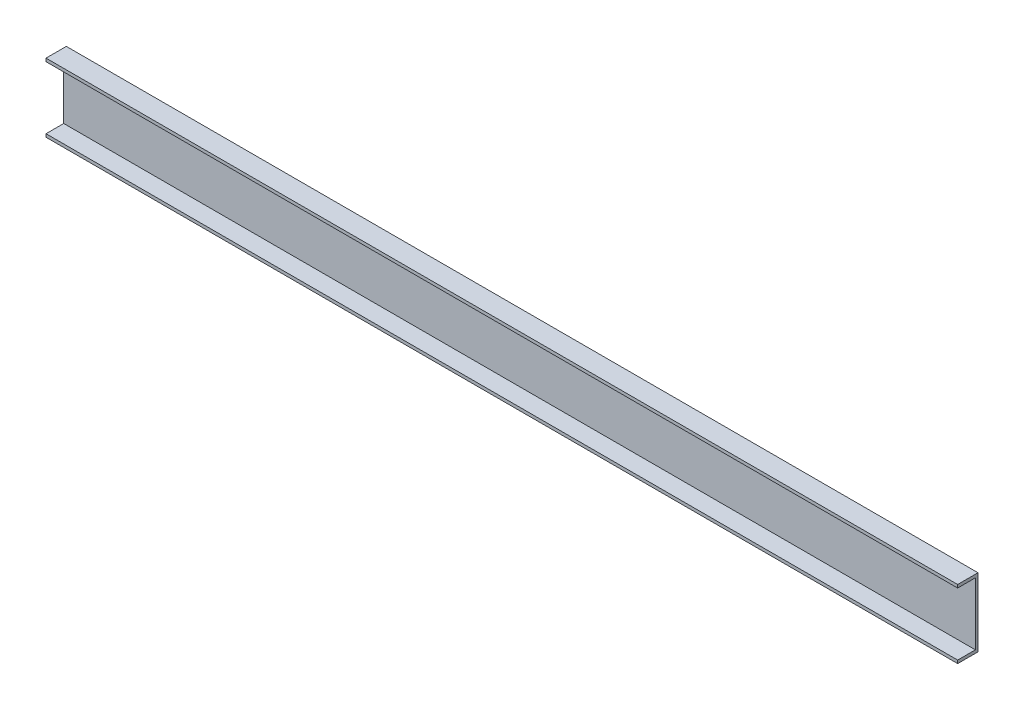
ISO-10303-21;
HEADER;
FILE_DESCRIPTION(('STEP AP214'),'2;1');
FILE_NAME('part.step','',(''),(''),'','','');
FILE_SCHEMA(('AUTOMOTIVE_DESIGN { 1 0 10303 214 1 1 1 1 }'));
ENDSEC;
DATA;
#1=APPLICATION_CONTEXT('core data for automotive mechanical design processes');
#2=APPLICATION_PROTOCOL_DEFINITION('international standard','automotive_design',2000,#1);
#3=PRODUCT_CONTEXT('',#1,'mechanical');
#4=PRODUCT('Part','Part','',(#3));
#5=PRODUCT_RELATED_PRODUCT_CATEGORY('part','',(#4));
#6=PRODUCT_DEFINITION_FORMATION('','',#4);
#7=PRODUCT_DEFINITION_CONTEXT('part definition',#1,'design');
#8=PRODUCT_DEFINITION('design','',#6,#7);
#9=PRODUCT_DEFINITION_SHAPE('','',#8);
#10=(LENGTH_UNIT() NAMED_UNIT(*) SI_UNIT(.MILLI.,.METRE.));
#11=(NAMED_UNIT(*) PLANE_ANGLE_UNIT() SI_UNIT($,.RADIAN.));
#12=(NAMED_UNIT(*) SI_UNIT($,.STERADIAN.) SOLID_ANGLE_UNIT());
#13=UNCERTAINTY_MEASURE_WITH_UNIT(LENGTH_MEASURE(1.E-05),#10,'distance_accuracy_value','');
#14=(GEOMETRIC_REPRESENTATION_CONTEXT(3) GLOBAL_UNCERTAINTY_ASSIGNED_CONTEXT((#13)) GLOBAL_UNIT_ASSIGNED_CONTEXT((#10,
#11,#12)) REPRESENTATION_CONTEXT('',''));
#15=CARTESIAN_POINT('',(0.,0.,0.));
#16=DIRECTION('',(0.,0.,1.));
#17=DIRECTION('',(1.,0.,0.));
#18=AXIS2_PLACEMENT_3D('',#15,#16,#17);
#19=CARTESIAN_POINT('',(-1995.,-150.,0.));
#20=DIRECTION('',(0.,0.,1.));
#21=DIRECTION('',(1.,0.,0.));
#22=AXIS2_PLACEMENT_3D('',#19,#20,#21);
#23=PLANE('',#22);
#24=DIRECTION('',(1.,0.,0.));
#25=VECTOR('',#24,1.);
#26=CARTESIAN_POINT('',(-935.,115.,0.));
#27=LINE('',#26,#25);
#28=CARTESIAN_POINT('',(-935.,115.,0.));
#29=VERTEX_POINT('',#28);
#30=CARTESIAN_POINT('',(-865.,115.,0.));
#31=VERTEX_POINT('',#30);
#32=EDGE_CURVE('E265',#29,#31,#27,.T.);
#33=ORIENTED_EDGE('',*,*,#32,.F.);
#34=DIRECTION('',(0.,1.,0.));
#35=VECTOR('',#34,1.);
#36=CARTESIAN_POINT('',(-935.,115.,0.));
#37=LINE('',#36,#35);
#38=CARTESIAN_POINT('',(-935.,-115.,0.));
#39=VERTEX_POINT('',#38);
#40=EDGE_CURVE('E278',#39,#29,#37,.T.);
#41=ORIENTED_EDGE('',*,*,#40,.F.);
#42=DIRECTION('',(-1.,0.,0.));
#43=VECTOR('',#42,1.);
#44=CARTESIAN_POINT('',(-935.,-115.,0.));
#45=LINE('',#44,#43);
#46=CARTESIAN_POINT('',(-865.,-115.,0.));
#47=VERTEX_POINT('',#46);
#48=EDGE_CURVE('E287',#47,#39,#45,.T.);
#49=ORIENTED_EDGE('',*,*,#48,.F.);
#50=DIRECTION('',(0.,-1.,0.));
#51=VECTOR('',#50,1.);
#52=CARTESIAN_POINT('',(-865.,115.,0.));
#53=LINE('',#52,#51);
#54=EDGE_CURVE('E268',#31,#47,#53,.T.);
#55=ORIENTED_EDGE('',*,*,#54,.F.);
#56=EDGE_LOOP('',(#33,#41,#49,#55));
#57=FACE_BOUND('',#56,.T.);
#58=DIRECTION('',(0.,-1.,0.));
#59=VECTOR('',#58,1.);
#60=CARTESIAN_POINT('',(535.,115.,0.));
#61=LINE('',#60,#59);
#62=CARTESIAN_POINT('',(535.,115.,0.));
#63=VERTEX_POINT('',#62);
#64=CARTESIAN_POINT('',(535.,-115.,0.));
#65=VERTEX_POINT('',#64);
#66=EDGE_CURVE('E336',#63,#65,#61,.T.);
#67=ORIENTED_EDGE('',*,*,#66,.F.);
#68=DIRECTION('',(1.,0.,0.));
#69=VECTOR('',#68,1.);
#70=CARTESIAN_POINT('',(535.,115.,0.));
#71=LINE('',#70,#69);
#72=CARTESIAN_POINT('',(465.,115.,0.));
#73=VERTEX_POINT('',#72);
#74=EDGE_CURVE('E341',#73,#63,#71,.T.);
#75=ORIENTED_EDGE('',*,*,#74,.F.);
#76=DIRECTION('',(0.,1.,0.));
#77=VECTOR('',#76,1.);
#78=CARTESIAN_POINT('',(465.,115.,0.));
#79=LINE('',#78,#77);
#80=CARTESIAN_POINT('',(465.,-115.,0.));
#81=VERTEX_POINT('',#80);
#82=EDGE_CURVE('E353',#81,#73,#79,.T.);
#83=ORIENTED_EDGE('',*,*,#82,.F.);
#84=DIRECTION('',(-1.,0.,0.));
#85=VECTOR('',#84,1.);
#86=CARTESIAN_POINT('',(535.,-115.,0.));
#87=LINE('',#86,#85);
#88=EDGE_CURVE('E350',#65,#81,#87,.T.);
#89=ORIENTED_EDGE('',*,*,#88,.F.);
#90=EDGE_LOOP('',(#67,#75,#83,#89));
#91=FACE_BOUND('',#90,.T.);
#92=DIRECTION('',(0.,-1.,0.));
#93=VECTOR('',#92,1.);
#94=CARTESIAN_POINT('',(1335.,115.,0.));
#95=LINE('',#94,#93);
#96=CARTESIAN_POINT('',(1335.,115.,0.));
#97=VERTEX_POINT('',#96);
#98=CARTESIAN_POINT('',(1335.,-115.,0.));
#99=VERTEX_POINT('',#98);
#100=EDGE_CURVE('E402',#97,#99,#95,.T.);
#101=ORIENTED_EDGE('',*,*,#100,.F.);
#102=DIRECTION('',(1.,0.,0.));
#103=VECTOR('',#102,1.);
#104=CARTESIAN_POINT('',(1335.,115.,0.));
#105=LINE('',#104,#103);
#106=CARTESIAN_POINT('',(1265.,115.,0.));
#107=VERTEX_POINT('',#106);
#108=EDGE_CURVE('E407',#107,#97,#105,.T.);
#109=ORIENTED_EDGE('',*,*,#108,.F.);
#110=DIRECTION('',(0.,1.,0.));
#111=VECTOR('',#110,1.);
#112=CARTESIAN_POINT('',(1265.,115.,0.));
#113=LINE('',#112,#111);
#114=CARTESIAN_POINT('',(1265.,-115.,0.));
#115=VERTEX_POINT('',#114);
#116=EDGE_CURVE('E419',#115,#107,#113,.T.);
#117=ORIENTED_EDGE('',*,*,#116,.F.);
#118=DIRECTION('',(-1.,0.,0.));
#119=VECTOR('',#118,1.);
#120=CARTESIAN_POINT('',(1335.,-115.,0.));
#121=LINE('',#120,#119);
#122=EDGE_CURVE('E416',#99,#115,#121,.T.);
#123=ORIENTED_EDGE('',*,*,#122,.F.);
#124=EDGE_LOOP('',(#101,#109,#117,#123));
#125=FACE_BOUND('',#124,.T.);
#126=DIRECTION('',(0.,-1.,0.));
#127=VECTOR('',#126,1.);
#128=CARTESIAN_POINT('',(-1995.,150.,0.));
#129=LINE('',#128,#127);
#130=CARTESIAN_POINT('',(-1995.,150.,0.));
#131=VERTEX_POINT('',#130);
#132=CARTESIAN_POINT('',(-1995.,-150.,0.));
#133=VERTEX_POINT('',#132);
#134=EDGE_CURVE('E481',#131,#133,#129,.T.);
#135=ORIENTED_EDGE('',*,*,#134,.F.);
#136=DIRECTION('',(-1.,0.,0.));
#137=VECTOR('',#136,1.);
#138=CARTESIAN_POINT('',(-1995.,150.,0.));
#139=LINE('',#138,#137);
#140=CARTESIAN_POINT('',(1995.,150.,0.));
#141=VERTEX_POINT('',#140);
#142=EDGE_CURVE('E496',#141,#131,#139,.T.);
#143=ORIENTED_EDGE('',*,*,#142,.F.);
#144=DIRECTION('',(0.,1.,0.));
#145=VECTOR('',#144,1.);
#146=CARTESIAN_POINT('',(1995.,150.,0.));
#147=LINE('',#146,#145);
#148=CARTESIAN_POINT('',(1995.,-150.,0.));
#149=VERTEX_POINT('',#148);
#150=EDGE_CURVE('E491',#149,#141,#147,.T.);
#151=ORIENTED_EDGE('',*,*,#150,.F.);
#152=DIRECTION('',(1.,0.,0.));
#153=VECTOR('',#152,1.);
#154=CARTESIAN_POINT('',(-1995.,-150.,0.));
#155=LINE('',#154,#153);
#156=EDGE_CURVE('E486',#133,#149,#155,.T.);
#157=ORIENTED_EDGE('',*,*,#156,.F.);
#158=EDGE_LOOP('',(#135,#143,#151,#157));
#159=FACE_BOUND('',#158,.T.);
#160=DIRECTION('',(0.,-1.,0.));
#161=VECTOR('',#160,1.);
#162=CARTESIAN_POINT('',(935.,115.,0.));
#163=LINE('',#162,#161);
#164=CARTESIAN_POINT('',(935.,115.,0.));
#165=VERTEX_POINT('',#164);
#166=CARTESIAN_POINT('',(935.,-115.,0.));
#167=VERTEX_POINT('',#166);
#168=EDGE_CURVE('E369',#165,#167,#163,.T.);
#169=ORIENTED_EDGE('',*,*,#168,.F.);
#170=DIRECTION('',(1.,0.,0.));
#171=VECTOR('',#170,1.);
#172=CARTESIAN_POINT('',(935.,115.,0.));
#173=LINE('',#172,#171);
#174=CARTESIAN_POINT('',(865.,115.,0.));
#175=VERTEX_POINT('',#174);
#176=EDGE_CURVE('E374',#175,#165,#173,.T.);
#177=ORIENTED_EDGE('',*,*,#176,.F.);
#178=DIRECTION('',(0.,1.,0.));
#179=VECTOR('',#178,1.);
#180=CARTESIAN_POINT('',(865.,115.,0.));
#181=LINE('',#180,#179);
#182=CARTESIAN_POINT('',(865.,-115.,0.));
#183=VERTEX_POINT('',#182);
#184=EDGE_CURVE('E386',#183,#175,#181,.T.);
#185=ORIENTED_EDGE('',*,*,#184,.F.);
#186=DIRECTION('',(-1.,0.,0.));
#187=VECTOR('',#186,1.);
#188=CARTESIAN_POINT('',(935.,-115.,0.));
#189=LINE('',#188,#187);
#190=EDGE_CURVE('E383',#167,#183,#189,.T.);
#191=ORIENTED_EDGE('',*,*,#190,.F.);
#192=EDGE_LOOP('',(#169,#177,#185,#191));
#193=FACE_BOUND('',#192,.T.);
#194=DIRECTION('',(1.,0.,0.));
#195=VECTOR('',#194,1.);
#196=CARTESIAN_POINT('',(-535.,115.,0.));
#197=LINE('',#196,#195);
#198=CARTESIAN_POINT('',(-535.,115.,0.));
#199=VERTEX_POINT('',#198);
#200=CARTESIAN_POINT('',(-465.,115.,0.));
#201=VERTEX_POINT('',#200);
#202=EDGE_CURVE('E303',#199,#201,#197,.T.);
#203=ORIENTED_EDGE('',*,*,#202,.F.);
#204=DIRECTION('',(0.,1.,0.));
#205=VECTOR('',#204,1.);
#206=CARTESIAN_POINT('',(-535.,115.,0.));
#207=LINE('',#206,#205);
#208=CARTESIAN_POINT('',(-535.,-115.,0.));
#209=VERTEX_POINT('',#208);
#210=EDGE_CURVE('E308',#209,#199,#207,.T.);
#211=ORIENTED_EDGE('',*,*,#210,.F.);
#212=DIRECTION('',(-1.,0.,0.));
#213=VECTOR('',#212,1.);
#214=CARTESIAN_POINT('',(-535.,-115.,0.));
#215=LINE('',#214,#213);
#216=CARTESIAN_POINT('',(-465.,-115.,0.));
#217=VERTEX_POINT('',#216);
#218=EDGE_CURVE('E320',#217,#209,#215,.T.);
#219=ORIENTED_EDGE('',*,*,#218,.F.);
#220=DIRECTION('',(0.,-1.,0.));
#221=VECTOR('',#220,1.);
#222=CARTESIAN_POINT('',(-465.,115.,0.));
#223=LINE('',#222,#221);
#224=EDGE_CURVE('E317',#201,#217,#223,.T.);
#225=ORIENTED_EDGE('',*,*,#224,.F.);
#226=EDGE_LOOP('',(#203,#211,#219,#225));
#227=FACE_BOUND('',#226,.T.);
#228=DIRECTION('',(1.,0.,0.));
#229=VECTOR('',#228,1.);
#230=CARTESIAN_POINT('',(-1335.,115.,0.));
#231=LINE('',#230,#229);
#232=CARTESIAN_POINT('',(-1335.,115.,0.));
#233=VERTEX_POINT('',#232);
#234=CARTESIAN_POINT('',(-1265.,115.,0.));
#235=VERTEX_POINT('',#234);
#236=EDGE_CURVE('E264',#233,#235,#231,.T.);
#237=ORIENTED_EDGE('',*,*,#236,.F.);
#238=DIRECTION('',(0.,1.,0.));
#239=VECTOR('',#238,1.);
#240=CARTESIAN_POINT('',(-1335.,115.,0.));
#241=LINE('',#240,#239);
#242=CARTESIAN_POINT('',(-1335.,-115.,0.));
#243=VERTEX_POINT('',#242);
#244=EDGE_CURVE('E261',#243,#233,#241,.T.);
#245=ORIENTED_EDGE('',*,*,#244,.F.);
#246=DIRECTION('',(-1.,0.,0.));
#247=VECTOR('',#246,1.);
#248=CARTESIAN_POINT('',(-1335.,-115.,0.));
#249=LINE('',#248,#247);
#250=CARTESIAN_POINT('',(-1265.,-115.,0.));
#251=VERTEX_POINT('',#250);
#252=EDGE_CURVE('E55',#251,#243,#249,.T.);
#253=ORIENTED_EDGE('',*,*,#252,.F.);
#254=DIRECTION('',(0.,-1.,0.));
#255=VECTOR('',#254,1.);
#256=CARTESIAN_POINT('',(-1265.,115.,0.));
#257=LINE('',#256,#255);
#258=EDGE_CURVE('E50',#235,#251,#257,.T.);
#259=ORIENTED_EDGE('',*,*,#258,.F.);
#260=EDGE_LOOP('',(#237,#245,#253,#259));
#261=FACE_BOUND('',#260,.T.);
#262=ADVANCED_FACE('F32',(#57,#91,#125,#159,#193,#227,#261),#23,.F.);
#263=CARTESIAN_POINT('',(-1995.,-150.,11.5));
#264=DIRECTION('',(0.,0.,1.));
#265=DIRECTION('',(1.,0.,0.));
#266=AXIS2_PLACEMENT_3D('',#263,#264,#265);
#267=PLANE('',#266);
#268=DIRECTION('',(0.,-1.,0.));
#269=VECTOR('',#268,1.);
#270=CARTESIAN_POINT('',(-1995.,150.,11.5));
#271=LINE('',#270,#269);
#272=CARTESIAN_POINT('',(-1995.,136.5,11.5));
#273=VERTEX_POINT('',#272);
#274=CARTESIAN_POINT('',(-1995.,-136.5,11.5));
#275=VERTEX_POINT('',#274);
#276=EDGE_CURVE('E474',#273,#275,#271,.T.);
#277=ORIENTED_EDGE('',*,*,#276,.T.);
#278=DIRECTION('',(-1.,0.,0.));
#279=VECTOR('',#278,1.);
#280=CARTESIAN_POINT('',(-1995.,-136.5,11.5));
#281=LINE('',#280,#279);
#282=CARTESIAN_POINT('',(1995.,-136.5,11.5));
#283=VERTEX_POINT('',#282);
#284=EDGE_CURVE('E435',#283,#275,#281,.T.);
#285=ORIENTED_EDGE('',*,*,#284,.F.);
#286=DIRECTION('',(0.,1.,0.));
#287=VECTOR('',#286,1.);
#288=CARTESIAN_POINT('',(1995.,150.,11.5));
#289=LINE('',#288,#287);
#290=CARTESIAN_POINT('',(1995.,136.5,11.5));
#291=VERTEX_POINT('',#290);
#292=EDGE_CURVE('E36',#283,#291,#289,.T.);
#293=ORIENTED_EDGE('',*,*,#292,.T.);
#294=DIRECTION('',(1.,0.,0.));
#295=VECTOR('',#294,1.);
#296=CARTESIAN_POINT('',(-1995.,136.5,11.5));
#297=LINE('',#296,#295);
#298=EDGE_CURVE('E454',#273,#291,#297,.T.);
#299=ORIENTED_EDGE('',*,*,#298,.F.);
#300=EDGE_LOOP('',(#277,#285,#293,#299));
#301=FACE_BOUND('',#300,.T.);
#302=ADVANCED_FACE('F526',(#301),#267,.T.);
#303=CARTESIAN_POINT('',(-1995.,150.,11.5));
#304=DIRECTION('',(1.,0.,0.));
#305=DIRECTION('',(0.,0.,-1.));
#306=AXIS2_PLACEMENT_3D('',#303,#304,#305);
#307=PLANE('',#306);
#308=ORIENTED_EDGE('',*,*,#134,.T.);
#309=DIRECTION('',(0.,0.,-1.));
#310=VECTOR('',#309,1.);
#311=CARTESIAN_POINT('',(-1995.,-150.,11.5));
#312=LINE('',#311,#310);
#313=CARTESIAN_POINT('',(-1995.,-150.,89.));
#314=VERTEX_POINT('',#313);
#315=EDGE_CURVE('E11',#314,#133,#312,.T.);
#316=ORIENTED_EDGE('',*,*,#315,.F.);
#317=DIRECTION('',(0.,-1.,0.));
#318=VECTOR('',#317,1.);
#319=CARTESIAN_POINT('',(-1995.,-150.,89.));
#320=LINE('',#319,#318);
#321=CARTESIAN_POINT('',(-1995.,-136.5,89.));
#322=VERTEX_POINT('',#321);
#323=EDGE_CURVE('E443',#322,#314,#320,.T.);
#324=ORIENTED_EDGE('',*,*,#323,.F.);
#325=DIRECTION('',(0.,0.,-1.));
#326=VECTOR('',#325,1.);
#327=CARTESIAN_POINT('',(-1995.,-136.5,89.));
#328=LINE('',#327,#326);
#329=EDGE_CURVE('E446',#322,#275,#328,.T.);
#330=ORIENTED_EDGE('',*,*,#329,.T.);
#331=ORIENTED_EDGE('',*,*,#276,.F.);
#332=DIRECTION('',(0.,0.,-1.));
#333=VECTOR('',#332,1.);
#334=CARTESIAN_POINT('',(-1995.,136.5,89.));
#335=LINE('',#334,#333);
#336=CARTESIAN_POINT('',(-1995.,136.5,89.));
#337=VERTEX_POINT('',#336);
#338=EDGE_CURVE('E477',#337,#273,#335,.T.);
#339=ORIENTED_EDGE('',*,*,#338,.F.);
#340=DIRECTION('',(0.,-1.,0.));
#341=VECTOR('',#340,1.);
#342=CARTESIAN_POINT('',(-1995.,150.,89.));
#343=LINE('',#342,#341);
#344=CARTESIAN_POINT('',(-1995.,150.,89.));
#345=VERTEX_POINT('',#344);
#346=EDGE_CURVE('E455',#345,#337,#343,.T.);
#347=ORIENTED_EDGE('',*,*,#346,.F.);
#348=DIRECTION('',(0.,0.,-1.));
#349=VECTOR('',#348,1.);
#350=CARTESIAN_POINT('',(-1995.,150.,11.5));
#351=LINE('',#350,#349);
#352=EDGE_CURVE('E498',#345,#131,#351,.T.);
#353=ORIENTED_EDGE('',*,*,#352,.T.);
#354=EDGE_LOOP('',(#308,#316,#324,#330,#331,#339,#347,#353));
#355=FACE_BOUND('',#354,.T.);
#356=ADVANCED_FACE('F34',(#355),#307,.F.);
#357=CARTESIAN_POINT('',(-1995.,-150.,11.5));
#358=DIRECTION('',(0.,1.,0.));
#359=DIRECTION('',(-1.,0.,0.));
#360=AXIS2_PLACEMENT_3D('',#357,#358,#359);
#361=PLANE('',#360);
#362=ORIENTED_EDGE('',*,*,#156,.T.);
#363=DIRECTION('',(0.,0.,-1.));
#364=VECTOR('',#363,1.);
#365=CARTESIAN_POINT('',(1995.,-150.,11.5));
#366=LINE('',#365,#364);
#367=CARTESIAN_POINT('',(1995.,-150.,89.));
#368=VERTEX_POINT('',#367);
#369=EDGE_CURVE('E42',#368,#149,#366,.T.);
#370=ORIENTED_EDGE('',*,*,#369,.F.);
#371=DIRECTION('',(1.,0.,0.));
#372=VECTOR('',#371,1.);
#373=CARTESIAN_POINT('',(-1995.,-150.,89.));
#374=LINE('',#373,#372);
#375=EDGE_CURVE('E436',#314,#368,#374,.T.);
#376=ORIENTED_EDGE('',*,*,#375,.F.);
#377=ORIENTED_EDGE('',*,*,#315,.T.);
#378=EDGE_LOOP('',(#362,#370,#376,#377));
#379=FACE_BOUND('',#378,.T.);
#380=ADVANCED_FACE('F534',(#379),#361,.F.);
#381=CARTESIAN_POINT('',(1995.,150.,11.5));
#382=DIRECTION('',(-1.,0.,0.));
#383=DIRECTION('',(0.,0.,1.));
#384=AXIS2_PLACEMENT_3D('',#381,#382,#383);
#385=PLANE('',#384);
#386=ORIENTED_EDGE('',*,*,#150,.T.);
#387=DIRECTION('',(0.,0.,-1.));
#388=VECTOR('',#387,1.);
#389=CARTESIAN_POINT('',(1995.,150.,11.5));
#390=LINE('',#389,#388);
#391=CARTESIAN_POINT('',(1995.,150.,89.));
#392=VERTEX_POINT('',#391);
#393=EDGE_CURVE('E500',#392,#141,#390,.T.);
#394=ORIENTED_EDGE('',*,*,#393,.F.);
#395=DIRECTION('',(0.,1.,0.));
#396=VECTOR('',#395,1.);
#397=CARTESIAN_POINT('',(1995.,150.,89.));
#398=LINE('',#397,#396);
#399=CARTESIAN_POINT('',(1995.,136.5,89.));
#400=VERTEX_POINT('',#399);
#401=EDGE_CURVE('E460',#400,#392,#398,.T.);
#402=ORIENTED_EDGE('',*,*,#401,.F.);
#403=DIRECTION('',(0.,0.,-1.));
#404=VECTOR('',#403,1.);
#405=CARTESIAN_POINT('',(1995.,136.5,89.));
#406=LINE('',#405,#404);
#407=EDGE_CURVE('E466',#400,#291,#406,.T.);
#408=ORIENTED_EDGE('',*,*,#407,.T.);
#409=ORIENTED_EDGE('',*,*,#292,.F.);
#410=DIRECTION('',(0.,0.,-1.));
#411=VECTOR('',#410,1.);
#412=CARTESIAN_POINT('',(1995.,-136.5,89.));
#413=LINE('',#412,#411);
#414=CARTESIAN_POINT('',(1995.,-136.5,89.));
#415=VERTEX_POINT('',#414);
#416=EDGE_CURVE('E451',#415,#283,#413,.T.);
#417=ORIENTED_EDGE('',*,*,#416,.F.);
#418=DIRECTION('',(0.,1.,0.));
#419=VECTOR('',#418,1.);
#420=CARTESIAN_POINT('',(1995.,-150.,89.));
#421=LINE('',#420,#419);
#422=EDGE_CURVE('E439',#368,#415,#421,.T.);
#423=ORIENTED_EDGE('',*,*,#422,.F.);
#424=ORIENTED_EDGE('',*,*,#369,.T.);
#425=EDGE_LOOP('',(#386,#394,#402,#408,#409,#417,#423,#424));
#426=FACE_BOUND('',#425,.T.);
#427=ADVANCED_FACE('F507',(#426),#385,.F.);
#428=CARTESIAN_POINT('',(-1995.,150.,11.5));
#429=DIRECTION('',(0.,-1.,0.));
#430=DIRECTION('',(1.,0.,0.));
#431=AXIS2_PLACEMENT_3D('',#428,#429,#430);
#432=PLANE('',#431);
#433=ORIENTED_EDGE('',*,*,#142,.T.);
#434=ORIENTED_EDGE('',*,*,#352,.F.);
#435=DIRECTION('',(-1.,0.,0.));
#436=VECTOR('',#435,1.);
#437=CARTESIAN_POINT('',(-1995.,150.,89.));
#438=LINE('',#437,#436);
#439=EDGE_CURVE('E463',#392,#345,#438,.T.);
#440=ORIENTED_EDGE('',*,*,#439,.F.);
#441=ORIENTED_EDGE('',*,*,#393,.T.);
#442=EDGE_LOOP('',(#433,#434,#440,#441));
#443=FACE_BOUND('',#442,.T.);
#444=ADVANCED_FACE('F515',(#443),#432,.F.);
#445=CARTESIAN_POINT('',(-1995.,136.5,89.));
#446=DIRECTION('',(0.,1.,0.));
#447=DIRECTION('',(0.,0.,1.));
#448=AXIS2_PLACEMENT_3D('',#445,#446,#447);
#449=PLANE('',#448);
#450=ORIENTED_EDGE('',*,*,#298,.T.);
#451=ORIENTED_EDGE('',*,*,#407,.F.);
#452=DIRECTION('',(1.,0.,0.));
#453=VECTOR('',#452,1.);
#454=CARTESIAN_POINT('',(-1995.,136.5,89.));
#455=LINE('',#454,#453);
#456=EDGE_CURVE('E458',#337,#400,#455,.T.);
#457=ORIENTED_EDGE('',*,*,#456,.F.);
#458=ORIENTED_EDGE('',*,*,#338,.T.);
#459=EDGE_LOOP('',(#450,#451,#457,#458));
#460=FACE_BOUND('',#459,.T.);
#461=ADVANCED_FACE('F524',(#460),#449,.F.);
#462=CARTESIAN_POINT('',(-1995.,136.5,89.));
#463=DIRECTION('',(0.,0.,1.));
#464=DIRECTION('',(1.,0.,0.));
#465=AXIS2_PLACEMENT_3D('',#462,#463,#464);
#466=PLANE('',#465);
#467=ORIENTED_EDGE('',*,*,#346,.T.);
#468=ORIENTED_EDGE('',*,*,#456,.T.);
#469=ORIENTED_EDGE('',*,*,#401,.T.);
#470=ORIENTED_EDGE('',*,*,#439,.T.);
#471=EDGE_LOOP('',(#467,#468,#469,#470));
#472=FACE_BOUND('',#471,.T.);
#473=ADVANCED_FACE('F520',(#472),#466,.T.);
#474=CARTESIAN_POINT('',(-1995.,-136.5,89.));
#475=DIRECTION('',(0.,-1.,0.));
#476=DIRECTION('',(0.,0.,-1.));
#477=AXIS2_PLACEMENT_3D('',#474,#475,#476);
#478=PLANE('',#477);
#479=ORIENTED_EDGE('',*,*,#284,.T.);
#480=ORIENTED_EDGE('',*,*,#329,.F.);
#481=DIRECTION('',(-1.,0.,0.));
#482=VECTOR('',#481,1.);
#483=CARTESIAN_POINT('',(-1995.,-136.5,89.));
#484=LINE('',#483,#482);
#485=EDGE_CURVE('E441',#415,#322,#484,.T.);
#486=ORIENTED_EDGE('',*,*,#485,.F.);
#487=ORIENTED_EDGE('',*,*,#416,.T.);
#488=EDGE_LOOP('',(#479,#480,#486,#487));
#489=FACE_BOUND('',#488,.T.);
#490=ADVANCED_FACE('F531',(#489),#478,.F.);
#491=CARTESIAN_POINT('',(1995.,-150.,89.));
#492=DIRECTION('',(0.,0.,1.));
#493=DIRECTION('',(1.,0.,0.));
#494=AXIS2_PLACEMENT_3D('',#491,#492,#493);
#495=PLANE('',#494);
#496=ORIENTED_EDGE('',*,*,#375,.T.);
#497=ORIENTED_EDGE('',*,*,#422,.T.);
#498=ORIENTED_EDGE('',*,*,#485,.T.);
#499=ORIENTED_EDGE('',*,*,#323,.T.);
#500=EDGE_LOOP('',(#496,#497,#498,#499));
#501=FACE_BOUND('',#500,.T.);
#502=ADVANCED_FACE('F533',(#501),#495,.T.);
#503=CARTESIAN_POINT('',(1335.,115.,-16.));
#504=DIRECTION('',(-1.,0.,0.));
#505=DIRECTION('',(0.,0.,1.));
#506=AXIS2_PLACEMENT_3D('',#503,#504,#505);
#507=PLANE('',#506);
#508=ORIENTED_EDGE('',*,*,#100,.T.);
#509=DIRECTION('',(0.,0.,1.));
#510=VECTOR('',#509,1.);
#511=CARTESIAN_POINT('',(1335.,-115.,-16.));
#512=LINE('',#511,#510);
#513=CARTESIAN_POINT('',(1335.,-115.,-16.));
#514=VERTEX_POINT('',#513);
#515=EDGE_CURVE('E432',#514,#99,#512,.T.);
#516=ORIENTED_EDGE('',*,*,#515,.F.);
#517=DIRECTION('',(0.,-1.,0.));
#518=VECTOR('',#517,1.);
#519=CARTESIAN_POINT('',(1335.,115.,-16.));
#520=LINE('',#519,#518);
#521=CARTESIAN_POINT('',(1335.,115.,-16.));
#522=VERTEX_POINT('',#521);
#523=EDGE_CURVE('E403',#522,#514,#520,.T.);
#524=ORIENTED_EDGE('',*,*,#523,.F.);
#525=DIRECTION('',(0.,0.,1.));
#526=VECTOR('',#525,1.);
#527=CARTESIAN_POINT('',(1335.,115.,-16.));
#528=LINE('',#527,#526);
#529=EDGE_CURVE('E413',#522,#97,#528,.T.);
#530=ORIENTED_EDGE('',*,*,#529,.T.);
#531=EDGE_LOOP('',(#508,#516,#524,#530));
#532=FACE_BOUND('',#531,.T.);
#533=ADVANCED_FACE('F564',(#532),#507,.F.);
#534=CARTESIAN_POINT('',(1335.,-115.,-16.));
#535=DIRECTION('',(0.,1.,0.));
#536=DIRECTION('',(0.,0.,1.));
#537=AXIS2_PLACEMENT_3D('',#534,#535,#536);
#538=PLANE('',#537);
#539=ORIENTED_EDGE('',*,*,#122,.T.);
#540=DIRECTION('',(0.,0.,1.));
#541=VECTOR('',#540,1.);
#542=CARTESIAN_POINT('',(1265.,-115.,-16.));
#543=LINE('',#542,#541);
#544=CARTESIAN_POINT('',(1265.,-115.,-16.));
#545=VERTEX_POINT('',#544);
#546=EDGE_CURVE('E429',#545,#115,#543,.T.);
#547=ORIENTED_EDGE('',*,*,#546,.F.);
#548=DIRECTION('',(-1.,0.,0.));
#549=VECTOR('',#548,1.);
#550=CARTESIAN_POINT('',(1335.,-115.,-16.));
#551=LINE('',#550,#549);
#552=EDGE_CURVE('E406',#514,#545,#551,.T.);
#553=ORIENTED_EDGE('',*,*,#552,.F.);
#554=ORIENTED_EDGE('',*,*,#515,.T.);
#555=EDGE_LOOP('',(#539,#547,#553,#554));
#556=FACE_BOUND('',#555,.T.);
#557=ADVANCED_FACE('F567',(#556),#538,.F.);
#558=CARTESIAN_POINT('',(1265.,115.,-16.));
#559=DIRECTION('',(1.,0.,0.));
#560=DIRECTION('',(0.,0.,-1.));
#561=AXIS2_PLACEMENT_3D('',#558,#559,#560);
#562=PLANE('',#561);
#563=ORIENTED_EDGE('',*,*,#116,.T.);
#564=DIRECTION('',(0.,0.,1.));
#565=VECTOR('',#564,1.);
#566=CARTESIAN_POINT('',(1265.,115.,-16.));
#567=LINE('',#566,#565);
#568=CARTESIAN_POINT('',(1265.,115.,-16.));
#569=VERTEX_POINT('',#568);
#570=EDGE_CURVE('E426',#569,#107,#567,.T.);
#571=ORIENTED_EDGE('',*,*,#570,.F.);
#572=DIRECTION('',(0.,1.,0.));
#573=VECTOR('',#572,1.);
#574=CARTESIAN_POINT('',(1265.,115.,-16.));
#575=LINE('',#574,#573);
#576=EDGE_CURVE('E409',#545,#569,#575,.T.);
#577=ORIENTED_EDGE('',*,*,#576,.F.);
#578=ORIENTED_EDGE('',*,*,#546,.T.);
#579=EDGE_LOOP('',(#563,#571,#577,#578));
#580=FACE_BOUND('',#579,.T.);
#581=ADVANCED_FACE('F571',(#580),#562,.F.);
#582=CARTESIAN_POINT('',(1335.,115.,-16.));
#583=DIRECTION('',(0.,-1.,0.));
#584=DIRECTION('',(0.,0.,-1.));
#585=AXIS2_PLACEMENT_3D('',#582,#583,#584);
#586=PLANE('',#585);
#587=ORIENTED_EDGE('',*,*,#108,.T.);
#588=ORIENTED_EDGE('',*,*,#529,.F.);
#589=DIRECTION('',(1.,0.,0.));
#590=VECTOR('',#589,1.);
#591=CARTESIAN_POINT('',(1335.,115.,-16.));
#592=LINE('',#591,#590);
#593=EDGE_CURVE('E411',#569,#522,#592,.T.);
#594=ORIENTED_EDGE('',*,*,#593,.F.);
#595=ORIENTED_EDGE('',*,*,#570,.T.);
#596=EDGE_LOOP('',(#587,#588,#594,#595));
#597=FACE_BOUND('',#596,.T.);
#598=ADVANCED_FACE('F575',(#597),#586,.F.);
#599=CARTESIAN_POINT('',(1335.,-115.,-16.));
#600=DIRECTION('',(0.,0.,-1.));
#601=DIRECTION('',(-1.,0.,0.));
#602=AXIS2_PLACEMENT_3D('',#599,#600,#601);
#603=PLANE('',#602);
#604=ORIENTED_EDGE('',*,*,#523,.T.);
#605=ORIENTED_EDGE('',*,*,#552,.T.);
#606=ORIENTED_EDGE('',*,*,#576,.T.);
#607=ORIENTED_EDGE('',*,*,#593,.T.);
#608=EDGE_LOOP('',(#604,#605,#606,#607));
#609=FACE_BOUND('',#608,.T.);
#610=ADVANCED_FACE('F579',(#609),#603,.T.);
#611=CARTESIAN_POINT('',(935.,115.,-16.));
#612=DIRECTION('',(-1.,0.,0.));
#613=DIRECTION('',(0.,0.,1.));
#614=AXIS2_PLACEMENT_3D('',#611,#612,#613);
#615=PLANE('',#614);
#616=ORIENTED_EDGE('',*,*,#168,.T.);
#617=DIRECTION('',(0.,0.,1.));
#618=VECTOR('',#617,1.);
#619=CARTESIAN_POINT('',(935.,-115.,-16.));
#620=LINE('',#619,#618);
#621=CARTESIAN_POINT('',(935.,-115.,-16.));
#622=VERTEX_POINT('',#621);
#623=EDGE_CURVE('E399',#622,#167,#620,.T.);
#624=ORIENTED_EDGE('',*,*,#623,.F.);
#625=DIRECTION('',(0.,-1.,0.));
#626=VECTOR('',#625,1.);
#627=CARTESIAN_POINT('',(935.,115.,-16.));
#628=LINE('',#627,#626);
#629=CARTESIAN_POINT('',(935.,115.,-16.));
#630=VERTEX_POINT('',#629);
#631=EDGE_CURVE('E370',#630,#622,#628,.T.);
#632=ORIENTED_EDGE('',*,*,#631,.F.);
#633=DIRECTION('',(0.,0.,1.));
#634=VECTOR('',#633,1.);
#635=CARTESIAN_POINT('',(935.,115.,-16.));
#636=LINE('',#635,#634);
#637=EDGE_CURVE('E380',#630,#165,#636,.T.);
#638=ORIENTED_EDGE('',*,*,#637,.T.);
#639=EDGE_LOOP('',(#616,#624,#632,#638));
#640=FACE_BOUND('',#639,.T.);
#641=ADVANCED_FACE('F583',(#640),#615,.F.);
#642=CARTESIAN_POINT('',(935.,-115.,-16.));
#643=DIRECTION('',(0.,1.,0.));
#644=DIRECTION('',(-1.,0.,0.));
#645=AXIS2_PLACEMENT_3D('',#642,#643,#644);
#646=PLANE('',#645);
#647=ORIENTED_EDGE('',*,*,#190,.T.);
#648=DIRECTION('',(0.,0.,1.));
#649=VECTOR('',#648,1.);
#650=CARTESIAN_POINT('',(865.,-115.,-16.));
#651=LINE('',#650,#649);
#652=CARTESIAN_POINT('',(865.,-115.,-16.));
#653=VERTEX_POINT('',#652);
#654=EDGE_CURVE('E396',#653,#183,#651,.T.);
#655=ORIENTED_EDGE('',*,*,#654,.F.);
#656=DIRECTION('',(-1.,0.,0.));
#657=VECTOR('',#656,1.);
#658=CARTESIAN_POINT('',(935.,-115.,-16.));
#659=LINE('',#658,#657);
#660=EDGE_CURVE('E373',#622,#653,#659,.T.);
#661=ORIENTED_EDGE('',*,*,#660,.F.);
#662=ORIENTED_EDGE('',*,*,#623,.T.);
#663=EDGE_LOOP('',(#647,#655,#661,#662));
#664=FACE_BOUND('',#663,.T.);
#665=ADVANCED_FACE('F587',(#664),#646,.F.);
#666=CARTESIAN_POINT('',(865.,115.,-16.));
#667=DIRECTION('',(1.,0.,0.));
#668=DIRECTION('',(0.,0.,-1.));
#669=AXIS2_PLACEMENT_3D('',#666,#667,#668);
#670=PLANE('',#669);
#671=ORIENTED_EDGE('',*,*,#184,.T.);
#672=DIRECTION('',(0.,0.,1.));
#673=VECTOR('',#672,1.);
#674=CARTESIAN_POINT('',(865.,115.,-16.));
#675=LINE('',#674,#673);
#676=CARTESIAN_POINT('',(865.,115.,-16.));
#677=VERTEX_POINT('',#676);
#678=EDGE_CURVE('E393',#677,#175,#675,.T.);
#679=ORIENTED_EDGE('',*,*,#678,.F.);
#680=DIRECTION('',(0.,1.,0.));
#681=VECTOR('',#680,1.);
#682=CARTESIAN_POINT('',(865.,115.,-16.));
#683=LINE('',#682,#681);
#684=EDGE_CURVE('E376',#653,#677,#683,.T.);
#685=ORIENTED_EDGE('',*,*,#684,.F.);
#686=ORIENTED_EDGE('',*,*,#654,.T.);
#687=EDGE_LOOP('',(#671,#679,#685,#686));
#688=FACE_BOUND('',#687,.T.);
#689=ADVANCED_FACE('F591',(#688),#670,.F.);
#690=CARTESIAN_POINT('',(935.,115.,-16.));
#691=DIRECTION('',(0.,-1.,0.));
#692=DIRECTION('',(1.,0.,0.));
#693=AXIS2_PLACEMENT_3D('',#690,#691,#692);
#694=PLANE('',#693);
#695=ORIENTED_EDGE('',*,*,#176,.T.);
#696=ORIENTED_EDGE('',*,*,#637,.F.);
#697=DIRECTION('',(1.,0.,0.));
#698=VECTOR('',#697,1.);
#699=CARTESIAN_POINT('',(935.,115.,-16.));
#700=LINE('',#699,#698);
#701=EDGE_CURVE('E378',#677,#630,#700,.T.);
#702=ORIENTED_EDGE('',*,*,#701,.F.);
#703=ORIENTED_EDGE('',*,*,#678,.T.);
#704=EDGE_LOOP('',(#695,#696,#702,#703));
#705=FACE_BOUND('',#704,.T.);
#706=ADVANCED_FACE('F595',(#705),#694,.F.);
#707=CARTESIAN_POINT('',(935.,-115.,-16.));
#708=DIRECTION('',(0.,0.,-1.));
#709=DIRECTION('',(-1.,0.,0.));
#710=AXIS2_PLACEMENT_3D('',#707,#708,#709);
#711=PLANE('',#710);
#712=ORIENTED_EDGE('',*,*,#631,.T.);
#713=ORIENTED_EDGE('',*,*,#660,.T.);
#714=ORIENTED_EDGE('',*,*,#684,.T.);
#715=ORIENTED_EDGE('',*,*,#701,.T.);
#716=EDGE_LOOP('',(#712,#713,#714,#715));
#717=FACE_BOUND('',#716,.T.);
#718=ADVANCED_FACE('F599',(#717),#711,.T.);
#719=CARTESIAN_POINT('',(535.,115.,-16.));
#720=DIRECTION('',(-1.,0.,0.));
#721=DIRECTION('',(0.,0.,1.));
#722=AXIS2_PLACEMENT_3D('',#719,#720,#721);
#723=PLANE('',#722);
#724=ORIENTED_EDGE('',*,*,#66,.T.);
#725=DIRECTION('',(0.,0.,1.));
#726=VECTOR('',#725,1.);
#727=CARTESIAN_POINT('',(535.,-115.,-16.));
#728=LINE('',#727,#726);
#729=CARTESIAN_POINT('',(535.,-115.,-16.));
#730=VERTEX_POINT('',#729);
#731=EDGE_CURVE('E366',#730,#65,#728,.T.);
#732=ORIENTED_EDGE('',*,*,#731,.F.);
#733=DIRECTION('',(0.,-1.,0.));
#734=VECTOR('',#733,1.);
#735=CARTESIAN_POINT('',(535.,115.,-16.));
#736=LINE('',#735,#734);
#737=CARTESIAN_POINT('',(535.,115.,-16.));
#738=VERTEX_POINT('',#737);
#739=EDGE_CURVE('E337',#738,#730,#736,.T.);
#740=ORIENTED_EDGE('',*,*,#739,.F.);
#741=DIRECTION('',(0.,0.,1.));
#742=VECTOR('',#741,1.);
#743=CARTESIAN_POINT('',(535.,115.,-16.));
#744=LINE('',#743,#742);
#745=EDGE_CURVE('E347',#738,#63,#744,.T.);
#746=ORIENTED_EDGE('',*,*,#745,.T.);
#747=EDGE_LOOP('',(#724,#732,#740,#746));
#748=FACE_BOUND('',#747,.T.);
#749=ADVANCED_FACE('F603',(#748),#723,.F.);
#750=CARTESIAN_POINT('',(535.,-115.,-16.));
#751=DIRECTION('',(0.,1.,0.));
#752=DIRECTION('',(-1.,0.,0.));
#753=AXIS2_PLACEMENT_3D('',#750,#751,#752);
#754=PLANE('',#753);
#755=ORIENTED_EDGE('',*,*,#88,.T.);
#756=DIRECTION('',(0.,0.,1.));
#757=VECTOR('',#756,1.);
#758=CARTESIAN_POINT('',(465.,-115.,-16.));
#759=LINE('',#758,#757);
#760=CARTESIAN_POINT('',(465.,-115.,-16.));
#761=VERTEX_POINT('',#760);
#762=EDGE_CURVE('E363',#761,#81,#759,.T.);
#763=ORIENTED_EDGE('',*,*,#762,.F.);
#764=DIRECTION('',(-1.,0.,0.));
#765=VECTOR('',#764,1.);
#766=CARTESIAN_POINT('',(535.,-115.,-16.));
#767=LINE('',#766,#765);
#768=EDGE_CURVE('E340',#730,#761,#767,.T.);
#769=ORIENTED_EDGE('',*,*,#768,.F.);
#770=ORIENTED_EDGE('',*,*,#731,.T.);
#771=EDGE_LOOP('',(#755,#763,#769,#770));
#772=FACE_BOUND('',#771,.T.);
#773=ADVANCED_FACE('F607',(#772),#754,.F.);
#774=CARTESIAN_POINT('',(465.,115.,-16.));
#775=DIRECTION('',(1.,0.,0.));
#776=DIRECTION('',(0.,0.,-1.));
#777=AXIS2_PLACEMENT_3D('',#774,#775,#776);
#778=PLANE('',#777);
#779=ORIENTED_EDGE('',*,*,#82,.T.);
#780=DIRECTION('',(0.,0.,1.));
#781=VECTOR('',#780,1.);
#782=CARTESIAN_POINT('',(465.,115.,-16.));
#783=LINE('',#782,#781);
#784=CARTESIAN_POINT('',(465.,115.,-16.));
#785=VERTEX_POINT('',#784);
#786=EDGE_CURVE('E360',#785,#73,#783,.T.);
#787=ORIENTED_EDGE('',*,*,#786,.F.);
#788=DIRECTION('',(0.,1.,0.));
#789=VECTOR('',#788,1.);
#790=CARTESIAN_POINT('',(465.,115.,-16.));
#791=LINE('',#790,#789);
#792=EDGE_CURVE('E343',#761,#785,#791,.T.);
#793=ORIENTED_EDGE('',*,*,#792,.F.);
#794=ORIENTED_EDGE('',*,*,#762,.T.);
#795=EDGE_LOOP('',(#779,#787,#793,#794));
#796=FACE_BOUND('',#795,.T.);
#797=ADVANCED_FACE('F611',(#796),#778,.F.);
#798=CARTESIAN_POINT('',(535.,115.,-16.));
#799=DIRECTION('',(0.,-1.,0.));
#800=DIRECTION('',(0.,0.,-1.));
#801=AXIS2_PLACEMENT_3D('',#798,#799,#800);
#802=PLANE('',#801);
#803=ORIENTED_EDGE('',*,*,#74,.T.);
#804=ORIENTED_EDGE('',*,*,#745,.F.);
#805=DIRECTION('',(1.,0.,0.));
#806=VECTOR('',#805,1.);
#807=CARTESIAN_POINT('',(535.,115.,-16.));
#808=LINE('',#807,#806);
#809=EDGE_CURVE('E345',#785,#738,#808,.T.);
#810=ORIENTED_EDGE('',*,*,#809,.F.);
#811=ORIENTED_EDGE('',*,*,#786,.T.);
#812=EDGE_LOOP('',(#803,#804,#810,#811));
#813=FACE_BOUND('',#812,.T.);
#814=ADVANCED_FACE('F615',(#813),#802,.F.);
#815=CARTESIAN_POINT('',(535.,115.,-16.));
#816=DIRECTION('',(0.,0.,-1.));
#817=DIRECTION('',(-1.,0.,0.));
#818=AXIS2_PLACEMENT_3D('',#815,#816,#817);
#819=PLANE('',#818);
#820=ORIENTED_EDGE('',*,*,#739,.T.);
#821=ORIENTED_EDGE('',*,*,#768,.T.);
#822=ORIENTED_EDGE('',*,*,#792,.T.);
#823=ORIENTED_EDGE('',*,*,#809,.T.);
#824=EDGE_LOOP('',(#820,#821,#822,#823));
#825=FACE_BOUND('',#824,.T.);
#826=ADVANCED_FACE('F619',(#825),#819,.T.);
#827=CARTESIAN_POINT('',(-535.,115.,-16.));
#828=DIRECTION('',(0.,-1.,0.));
#829=DIRECTION('',(0.,0.,-1.));
#830=AXIS2_PLACEMENT_3D('',#827,#828,#829);
#831=PLANE('',#830);
#832=ORIENTED_EDGE('',*,*,#202,.T.);
#833=DIRECTION('',(0.,0.,1.));
#834=VECTOR('',#833,1.);
#835=CARTESIAN_POINT('',(-465.,115.,-16.));
#836=LINE('',#835,#834);
#837=CARTESIAN_POINT('',(-465.,115.,-16.));
#838=VERTEX_POINT('',#837);
#839=EDGE_CURVE('E333',#838,#201,#836,.T.);
#840=ORIENTED_EDGE('',*,*,#839,.F.);
#841=DIRECTION('',(1.,0.,0.));
#842=VECTOR('',#841,1.);
#843=CARTESIAN_POINT('',(-535.,115.,-16.));
#844=LINE('',#843,#842);
#845=CARTESIAN_POINT('',(-535.,115.,-16.));
#846=VERTEX_POINT('',#845);
#847=EDGE_CURVE('E304',#846,#838,#844,.T.);
#848=ORIENTED_EDGE('',*,*,#847,.F.);
#849=DIRECTION('',(0.,0.,1.));
#850=VECTOR('',#849,1.);
#851=CARTESIAN_POINT('',(-535.,115.,-16.));
#852=LINE('',#851,#850);
#853=EDGE_CURVE('E314',#846,#199,#852,.T.);
#854=ORIENTED_EDGE('',*,*,#853,.T.);
#855=EDGE_LOOP('',(#832,#840,#848,#854));
#856=FACE_BOUND('',#855,.T.);
#857=ADVANCED_FACE('F623',(#856),#831,.F.);
#858=CARTESIAN_POINT('',(-465.,115.,-16.));
#859=DIRECTION('',(-1.,0.,0.));
#860=DIRECTION('',(0.,0.,1.));
#861=AXIS2_PLACEMENT_3D('',#858,#859,#860);
#862=PLANE('',#861);
#863=ORIENTED_EDGE('',*,*,#224,.T.);
#864=DIRECTION('',(0.,0.,1.));
#865=VECTOR('',#864,1.);
#866=CARTESIAN_POINT('',(-465.,-115.,-16.));
#867=LINE('',#866,#865);
#868=CARTESIAN_POINT('',(-465.,-115.,-16.));
#869=VERTEX_POINT('',#868);
#870=EDGE_CURVE('E330',#869,#217,#867,.T.);
#871=ORIENTED_EDGE('',*,*,#870,.F.);
#872=DIRECTION('',(0.,-1.,0.));
#873=VECTOR('',#872,1.);
#874=CARTESIAN_POINT('',(-465.,115.,-16.));
#875=LINE('',#874,#873);
#876=EDGE_CURVE('E307',#838,#869,#875,.T.);
#877=ORIENTED_EDGE('',*,*,#876,.F.);
#878=ORIENTED_EDGE('',*,*,#839,.T.);
#879=EDGE_LOOP('',(#863,#871,#877,#878));
#880=FACE_BOUND('',#879,.T.);
#881=ADVANCED_FACE('F627',(#880),#862,.F.);
#882=CARTESIAN_POINT('',(-535.,-115.,-16.));
#883=DIRECTION('',(0.,1.,0.));
#884=DIRECTION('',(-1.,0.,0.));
#885=AXIS2_PLACEMENT_3D('',#882,#883,#884);
#886=PLANE('',#885);
#887=ORIENTED_EDGE('',*,*,#218,.T.);
#888=DIRECTION('',(0.,0.,1.));
#889=VECTOR('',#888,1.);
#890=CARTESIAN_POINT('',(-535.,-115.,-16.));
#891=LINE('',#890,#889);
#892=CARTESIAN_POINT('',(-535.,-115.,-16.));
#893=VERTEX_POINT('',#892);
#894=EDGE_CURVE('E327',#893,#209,#891,.T.);
#895=ORIENTED_EDGE('',*,*,#894,.F.);
#896=DIRECTION('',(-1.,0.,0.));
#897=VECTOR('',#896,1.);
#898=CARTESIAN_POINT('',(-535.,-115.,-16.));
#899=LINE('',#898,#897);
#900=EDGE_CURVE('E310',#869,#893,#899,.T.);
#901=ORIENTED_EDGE('',*,*,#900,.F.);
#902=ORIENTED_EDGE('',*,*,#870,.T.);
#903=EDGE_LOOP('',(#887,#895,#901,#902));
#904=FACE_BOUND('',#903,.T.);
#905=ADVANCED_FACE('F631',(#904),#886,.F.);
#906=CARTESIAN_POINT('',(-535.,115.,-16.));
#907=DIRECTION('',(1.,0.,0.));
#908=DIRECTION('',(0.,0.,-1.));
#909=AXIS2_PLACEMENT_3D('',#906,#907,#908);
#910=PLANE('',#909);
#911=ORIENTED_EDGE('',*,*,#210,.T.);
#912=ORIENTED_EDGE('',*,*,#853,.F.);
#913=DIRECTION('',(0.,1.,0.));
#914=VECTOR('',#913,1.);
#915=CARTESIAN_POINT('',(-535.,115.,-16.));
#916=LINE('',#915,#914);
#917=EDGE_CURVE('E312',#893,#846,#916,.T.);
#918=ORIENTED_EDGE('',*,*,#917,.F.);
#919=ORIENTED_EDGE('',*,*,#894,.T.);
#920=EDGE_LOOP('',(#911,#912,#918,#919));
#921=FACE_BOUND('',#920,.T.);
#922=ADVANCED_FACE('F635',(#921),#910,.F.);
#923=CARTESIAN_POINT('',(-465.,115.,-16.));
#924=DIRECTION('',(0.,0.,-1.));
#925=DIRECTION('',(-1.,0.,0.));
#926=AXIS2_PLACEMENT_3D('',#923,#924,#925);
#927=PLANE('',#926);
#928=ORIENTED_EDGE('',*,*,#847,.T.);
#929=ORIENTED_EDGE('',*,*,#876,.T.);
#930=ORIENTED_EDGE('',*,*,#900,.T.);
#931=ORIENTED_EDGE('',*,*,#917,.T.);
#932=EDGE_LOOP('',(#928,#929,#930,#931));
#933=FACE_BOUND('',#932,.T.);
#934=ADVANCED_FACE('F639',(#933),#927,.T.);
#935=CARTESIAN_POINT('',(-935.,115.,-16.));
#936=DIRECTION('',(0.,-1.,0.));
#937=DIRECTION('',(1.,0.,0.));
#938=AXIS2_PLACEMENT_3D('',#935,#936,#937);
#939=PLANE('',#938);
#940=ORIENTED_EDGE('',*,*,#32,.T.);
#941=DIRECTION('',(0.,0.,1.));
#942=VECTOR('',#941,1.);
#943=CARTESIAN_POINT('',(-865.,115.,-16.));
#944=LINE('',#943,#942);
#945=CARTESIAN_POINT('',(-865.,115.,-16.));
#946=VERTEX_POINT('',#945);
#947=EDGE_CURVE('E300',#946,#31,#944,.T.);
#948=ORIENTED_EDGE('',*,*,#947,.F.);
#949=DIRECTION('',(1.,0.,0.));
#950=VECTOR('',#949,1.);
#951=CARTESIAN_POINT('',(-935.,115.,-16.));
#952=LINE('',#951,#950);
#953=CARTESIAN_POINT('',(-935.,115.,-16.));
#954=VERTEX_POINT('',#953);
#955=EDGE_CURVE('E274',#954,#946,#952,.T.);
#956=ORIENTED_EDGE('',*,*,#955,.F.);
#957=DIRECTION('',(0.,0.,1.));
#958=VECTOR('',#957,1.);
#959=CARTESIAN_POINT('',(-935.,115.,-16.));
#960=LINE('',#959,#958);
#961=EDGE_CURVE('E283',#954,#29,#960,.T.);
#962=ORIENTED_EDGE('',*,*,#961,.T.);
#963=EDGE_LOOP('',(#940,#948,#956,#962));
#964=FACE_BOUND('',#963,.T.);
#965=ADVANCED_FACE('F643',(#964),#939,.F.);
#966=CARTESIAN_POINT('',(-865.,115.,-16.));
#967=DIRECTION('',(-1.,0.,0.));
#968=DIRECTION('',(0.,0.,1.));
#969=AXIS2_PLACEMENT_3D('',#966,#967,#968);
#970=PLANE('',#969);
#971=ORIENTED_EDGE('',*,*,#54,.T.);
#972=DIRECTION('',(0.,0.,1.));
#973=VECTOR('',#972,1.);
#974=CARTESIAN_POINT('',(-865.,-115.,-16.));
#975=LINE('',#974,#973);
#976=CARTESIAN_POINT('',(-865.,-115.,-16.));
#977=VERTEX_POINT('',#976);
#978=EDGE_CURVE('E297',#977,#47,#975,.T.);
#979=ORIENTED_EDGE('',*,*,#978,.F.);
#980=DIRECTION('',(0.,-1.,0.));
#981=VECTOR('',#980,1.);
#982=CARTESIAN_POINT('',(-865.,115.,-16.));
#983=LINE('',#982,#981);
#984=EDGE_CURVE('E277',#946,#977,#983,.T.);
#985=ORIENTED_EDGE('',*,*,#984,.F.);
#986=ORIENTED_EDGE('',*,*,#947,.T.);
#987=EDGE_LOOP('',(#971,#979,#985,#986));
#988=FACE_BOUND('',#987,.T.);
#989=ADVANCED_FACE('F647',(#988),#970,.F.);
#990=CARTESIAN_POINT('',(-935.,-115.,-16.));
#991=DIRECTION('',(0.,1.,0.));
#992=DIRECTION('',(-1.,0.,0.));
#993=AXIS2_PLACEMENT_3D('',#990,#991,#992);
#994=PLANE('',#993);
#995=ORIENTED_EDGE('',*,*,#48,.T.);
#996=DIRECTION('',(0.,0.,1.));
#997=VECTOR('',#996,1.);
#998=CARTESIAN_POINT('',(-935.,-115.,-16.));
#999=LINE('',#998,#997);
#1000=CARTESIAN_POINT('',(-935.,-115.,-16.));
#1001=VERTEX_POINT('',#1000);
#1002=EDGE_CURVE('E294',#1001,#39,#999,.T.);
#1003=ORIENTED_EDGE('',*,*,#1002,.F.);
#1004=DIRECTION('',(-1.,0.,0.));
#1005=VECTOR('',#1004,1.);
#1006=CARTESIAN_POINT('',(-935.,-115.,-16.));
#1007=LINE('',#1006,#1005);
#1008=EDGE_CURVE('E280',#977,#1001,#1007,.T.);
#1009=ORIENTED_EDGE('',*,*,#1008,.F.);
#1010=ORIENTED_EDGE('',*,*,#978,.T.);
#1011=EDGE_LOOP('',(#995,#1003,#1009,#1010));
#1012=FACE_BOUND('',#1011,.T.);
#1013=ADVANCED_FACE('F651',(#1012),#994,.F.);
#1014=CARTESIAN_POINT('',(-935.,115.,-16.));
#1015=DIRECTION('',(1.,0.,0.));
#1016=DIRECTION('',(0.,0.,-1.));
#1017=AXIS2_PLACEMENT_3D('',#1014,#1015,#1016);
#1018=PLANE('',#1017);
#1019=ORIENTED_EDGE('',*,*,#40,.T.);
#1020=ORIENTED_EDGE('',*,*,#961,.F.);
#1021=DIRECTION('',(0.,1.,0.));
#1022=VECTOR('',#1021,1.);
#1023=CARTESIAN_POINT('',(-935.,115.,-16.));
#1024=LINE('',#1023,#1022);
#1025=EDGE_CURVE('E282',#1001,#954,#1024,.T.);
#1026=ORIENTED_EDGE('',*,*,#1025,.F.);
#1027=ORIENTED_EDGE('',*,*,#1002,.T.);
#1028=EDGE_LOOP('',(#1019,#1020,#1026,#1027));
#1029=FACE_BOUND('',#1028,.T.);
#1030=ADVANCED_FACE('F655',(#1029),#1018,.F.);
#1031=CARTESIAN_POINT('',(-865.,115.,-16.));
#1032=DIRECTION('',(0.,0.,-1.));
#1033=DIRECTION('',(-1.,0.,0.));
#1034=AXIS2_PLACEMENT_3D('',#1031,#1032,#1033);
#1035=PLANE('',#1034);
#1036=ORIENTED_EDGE('',*,*,#955,.T.);
#1037=ORIENTED_EDGE('',*,*,#984,.T.);
#1038=ORIENTED_EDGE('',*,*,#1008,.T.);
#1039=ORIENTED_EDGE('',*,*,#1025,.T.);
#1040=EDGE_LOOP('',(#1036,#1037,#1038,#1039));
#1041=FACE_BOUND('',#1040,.T.);
#1042=ADVANCED_FACE('F659',(#1041),#1035,.T.);
#1043=CARTESIAN_POINT('',(-1335.,115.,-16.));
#1044=DIRECTION('',(0.,-1.,0.));
#1045=DIRECTION('',(0.,0.,-1.));
#1046=AXIS2_PLACEMENT_3D('',#1043,#1044,#1045);
#1047=PLANE('',#1046);
#1048=ORIENTED_EDGE('',*,*,#236,.T.);
#1049=DIRECTION('',(0.,0.,1.));
#1050=VECTOR('',#1049,1.);
#1051=CARTESIAN_POINT('',(-1265.,115.,-16.));
#1052=LINE('',#1051,#1050);
#1053=CARTESIAN_POINT('',(-1265.,115.,-16.));
#1054=VERTEX_POINT('',#1053);
#1055=EDGE_CURVE('E245',#1054,#235,#1052,.T.);
#1056=ORIENTED_EDGE('',*,*,#1055,.F.);
#1057=DIRECTION('',(1.,0.,0.));
#1058=VECTOR('',#1057,1.);
#1059=CARTESIAN_POINT('',(-1335.,115.,-16.));
#1060=LINE('',#1059,#1058);
#1061=CARTESIAN_POINT('',(-1335.,115.,-16.));
#1062=VERTEX_POINT('',#1061);
#1063=EDGE_CURVE('E252',#1062,#1054,#1060,.T.);
#1064=ORIENTED_EDGE('',*,*,#1063,.F.);
#1065=DIRECTION('',(0.,0.,1.));
#1066=VECTOR('',#1065,1.);
#1067=CARTESIAN_POINT('',(-1335.,115.,-16.));
#1068=LINE('',#1067,#1066);
#1069=EDGE_CURVE('E929',#1062,#233,#1068,.T.);
#1070=ORIENTED_EDGE('',*,*,#1069,.T.);
#1071=EDGE_LOOP('',(#1048,#1056,#1064,#1070));
#1072=FACE_BOUND('',#1071,.T.);
#1073=ADVANCED_FACE('F263',(#1072),#1047,.F.);
#1074=CARTESIAN_POINT('',(-1265.,115.,-16.));
#1075=DIRECTION('',(-1.,0.,0.));
#1076=DIRECTION('',(0.,0.,1.));
#1077=AXIS2_PLACEMENT_3D('',#1074,#1075,#1076);
#1078=PLANE('',#1077);
#1079=ORIENTED_EDGE('',*,*,#258,.T.);
#1080=DIRECTION('',(0.,0.,1.));
#1081=VECTOR('',#1080,1.);
#1082=CARTESIAN_POINT('',(-1265.,-115.,-16.));
#1083=LINE('',#1082,#1081);
#1084=CARTESIAN_POINT('',(-1265.,-115.,-16.));
#1085=VERTEX_POINT('',#1084);
#1086=EDGE_CURVE('E248',#1085,#251,#1083,.T.);
#1087=ORIENTED_EDGE('',*,*,#1086,.F.);
#1088=DIRECTION('',(0.,-1.,0.));
#1089=VECTOR('',#1088,1.);
#1090=CARTESIAN_POINT('',(-1265.,115.,-16.));
#1091=LINE('',#1090,#1089);
#1092=EDGE_CURVE('E241',#1054,#1085,#1091,.T.);
#1093=ORIENTED_EDGE('',*,*,#1092,.F.);
#1094=ORIENTED_EDGE('',*,*,#1055,.T.);
#1095=EDGE_LOOP('',(#1079,#1087,#1093,#1094));
#1096=FACE_BOUND('',#1095,.T.);
#1097=ADVANCED_FACE('F243',(#1096),#1078,.F.);
#1098=CARTESIAN_POINT('',(-1335.,-115.,-16.));
#1099=DIRECTION('',(0.,1.,0.));
#1100=DIRECTION('',(0.,0.,1.));
#1101=AXIS2_PLACEMENT_3D('',#1098,#1099,#1100);
#1102=PLANE('',#1101);
#1103=ORIENTED_EDGE('',*,*,#252,.T.);
#1104=DIRECTION('',(0.,0.,1.));
#1105=VECTOR('',#1104,1.);
#1106=CARTESIAN_POINT('',(-1335.,-115.,-16.));
#1107=LINE('',#1106,#1105);
#1108=CARTESIAN_POINT('',(-1335.,-115.,-16.));
#1109=VERTEX_POINT('',#1108);
#1110=EDGE_CURVE('E270',#1109,#243,#1107,.T.);
#1111=ORIENTED_EDGE('',*,*,#1110,.F.);
#1112=DIRECTION('',(-1.,0.,0.));
#1113=VECTOR('',#1112,1.);
#1114=CARTESIAN_POINT('',(-1335.,-115.,-16.));
#1115=LINE('',#1114,#1113);
#1116=EDGE_CURVE('E251',#1085,#1109,#1115,.T.);
#1117=ORIENTED_EDGE('',*,*,#1116,.F.);
#1118=ORIENTED_EDGE('',*,*,#1086,.T.);
#1119=EDGE_LOOP('',(#1103,#1111,#1117,#1118));
#1120=FACE_BOUND('',#1119,.T.);
#1121=ADVANCED_FACE('F668',(#1120),#1102,.F.);
#1122=CARTESIAN_POINT('',(-1335.,115.,-16.));
#1123=DIRECTION('',(1.,0.,0.));
#1124=DIRECTION('',(0.,0.,-1.));
#1125=AXIS2_PLACEMENT_3D('',#1122,#1123,#1124);
#1126=PLANE('',#1125);
#1127=ORIENTED_EDGE('',*,*,#244,.T.);
#1128=ORIENTED_EDGE('',*,*,#1069,.F.);
#1129=DIRECTION('',(0.,1.,0.));
#1130=VECTOR('',#1129,1.);
#1131=CARTESIAN_POINT('',(-1335.,115.,-16.));
#1132=LINE('',#1131,#1130);
#1133=EDGE_CURVE('E257',#1109,#1062,#1132,.T.);
#1134=ORIENTED_EDGE('',*,*,#1133,.F.);
#1135=ORIENTED_EDGE('',*,*,#1110,.T.);
#1136=EDGE_LOOP('',(#1127,#1128,#1134,#1135));
#1137=FACE_BOUND('',#1136,.T.);
#1138=ADVANCED_FACE('F671',(#1137),#1126,.F.);
#1139=CARTESIAN_POINT('',(-1265.,115.,-16.));
#1140=DIRECTION('',(0.,0.,-1.));
#1141=DIRECTION('',(-1.,0.,0.));
#1142=AXIS2_PLACEMENT_3D('',#1139,#1140,#1141);
#1143=PLANE('',#1142);
#1144=ORIENTED_EDGE('',*,*,#1063,.T.);
#1145=ORIENTED_EDGE('',*,*,#1092,.T.);
#1146=ORIENTED_EDGE('',*,*,#1116,.T.);
#1147=ORIENTED_EDGE('',*,*,#1133,.T.);
#1148=EDGE_LOOP('',(#1144,#1145,#1146,#1147));
#1149=FACE_BOUND('',#1148,.T.);
#1150=ADVANCED_FACE('F255',(#1149),#1143,.T.);
#1151=CLOSED_SHELL('',(#262,#302,#356,#380,#427,#444,#461,#473,#490,#502,#533,#557,#581,#598,
#610,#641,#665,#689,#706,#718,#749,#773,#797,#814,#826,#857,#881,#905,#922,#934,#965,#989,#1013,
#1030,#1042,#1073,#1097,#1121,#1138,#1150));
#1152=MANIFOLD_SOLID_BREP('B2',#1151);
#1153=ADVANCED_BREP_SHAPE_REPRESENTATION('',(#18,#1152),#14);
#1154=SHAPE_DEFINITION_REPRESENTATION(#9,#1153);
ENDSEC;
END-ISO-10303-21;
